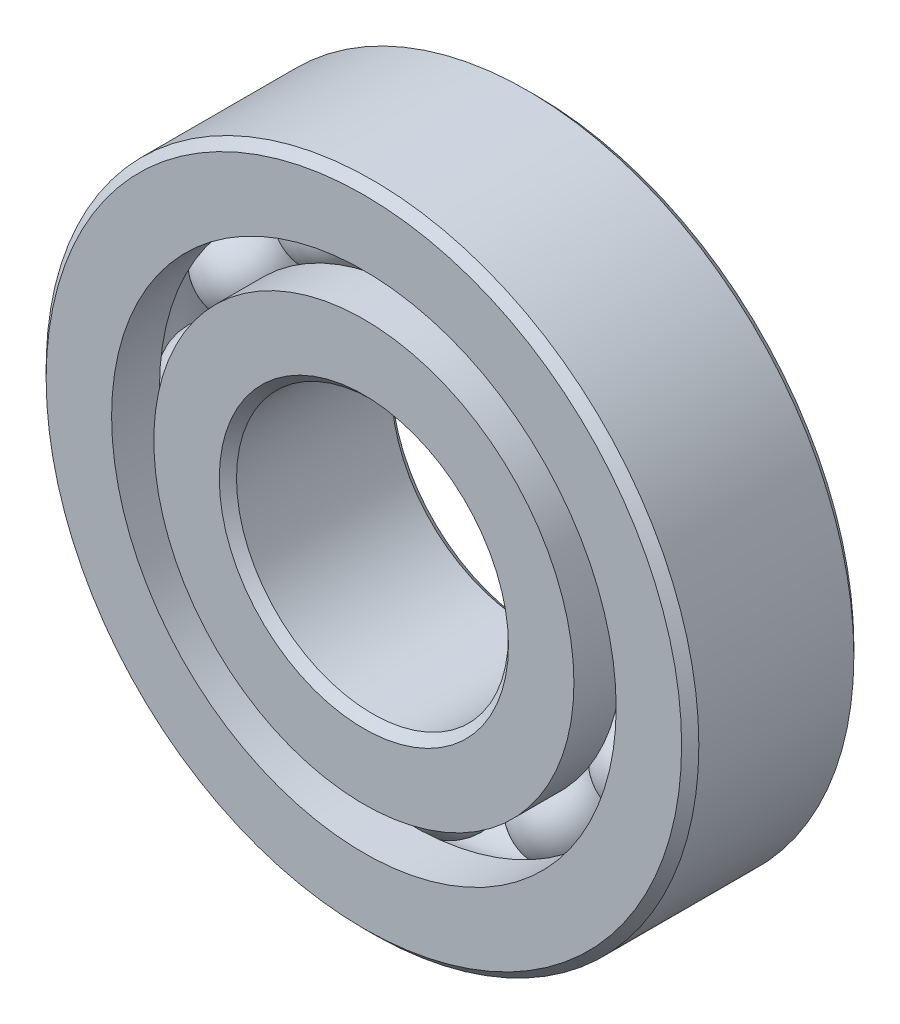
ISO-10303-21;
HEADER;
FILE_DESCRIPTION(('STEP AP214'),'2;1');
FILE_NAME('part.step','',(''),(''),'','','');
FILE_SCHEMA(('AUTOMOTIVE_DESIGN { 1 0 10303 214 1 1 1 1 }'));
ENDSEC;
DATA;
#1=APPLICATION_CONTEXT('core data for automotive mechanical design processes');
#2=APPLICATION_PROTOCOL_DEFINITION('international standard','automotive_design',2000,#1);
#3=PRODUCT_CONTEXT('',#1,'mechanical');
#4=PRODUCT('Part','Part','',(#3));
#5=PRODUCT_RELATED_PRODUCT_CATEGORY('part','',(#4));
#6=PRODUCT_DEFINITION_FORMATION('','',#4);
#7=PRODUCT_DEFINITION_CONTEXT('part definition',#1,'design');
#8=PRODUCT_DEFINITION('design','',#6,#7);
#9=PRODUCT_DEFINITION_SHAPE('','',#8);
#10=(LENGTH_UNIT() NAMED_UNIT(*) SI_UNIT(.MILLI.,.METRE.));
#11=(NAMED_UNIT(*) PLANE_ANGLE_UNIT() SI_UNIT($,.RADIAN.));
#12=(NAMED_UNIT(*) SI_UNIT($,.STERADIAN.) SOLID_ANGLE_UNIT());
#13=UNCERTAINTY_MEASURE_WITH_UNIT(LENGTH_MEASURE(1.E-05),#10,'distance_accuracy_value','');
#14=(GEOMETRIC_REPRESENTATION_CONTEXT(3) GLOBAL_UNCERTAINTY_ASSIGNED_CONTEXT((#13)) GLOBAL_UNIT_ASSIGNED_CONTEXT((#10,
#11,#12)) REPRESENTATION_CONTEXT('',''));
#15=CARTESIAN_POINT('',(0.,0.,0.));
#16=DIRECTION('',(0.,0.,1.));
#17=DIRECTION('',(1.,0.,0.));
#18=AXIS2_PLACEMENT_3D('',#15,#16,#17);
#19=CARTESIAN_POINT('',(-12.7499999999997,22.0836477965033,0.));
#20=DIRECTION('',(0.,0.,1.));
#21=DIRECTION('',(-0.499999999999989,0.866025403784445,0.));
#22=AXIS2_PLACEMENT_3D('',#19,#20,#21);
#23=SPHERICAL_SURFACE('',#22,4.82229450975087);
#24=CARTESIAN_POINT('',(-12.7499999999997,22.0836477965033,4.82229450975087));
#25=VERTEX_POINT('',#24);
#26=VERTEX_LOOP('',#25);
#27=FACE_BOUND('',#26,.T.);
#28=ADVANCED_FACE('F49',(#27),#23,.T.);
#29=CLOSED_SHELL('',(#28));
#30=MANIFOLD_SOLID_BREP('B2',#29);
#31=CARTESIAN_POINT('',(-22.083647796503,12.7500000000003,0.));
#32=DIRECTION('',(0.,0.,1.));
#33=DIRECTION('',(-0.866025403784433,0.50000000000001,0.));
#34=AXIS2_PLACEMENT_3D('',#31,#32,#33);
#35=SPHERICAL_SURFACE('',#34,4.82229450975087);
#36=CARTESIAN_POINT('',(-22.083647796503,12.7500000000003,4.82229450975087));
#37=VERTEX_POINT('',#36);
#38=VERTEX_LOOP('',#37);
#39=FACE_BOUND('',#38,.T.);
#40=ADVANCED_FACE('F74',(#39),#35,.T.);
#41=CLOSED_SHELL('',(#40));
#42=MANIFOLD_SOLID_BREP('B7',#41);
#43=CARTESIAN_POINT('',(-25.5,2.670983224215E-13,0.));
#44=DIRECTION('',(0.,0.,1.));
#45=DIRECTION('',(-1.,0.,0.));
#46=AXIS2_PLACEMENT_3D('',#43,#44,#45);
#47=SPHERICAL_SURFACE('',#46,4.82229450975087);
#48=CARTESIAN_POINT('',(-25.5,2.670983224215E-13,4.82229450975087));
#49=VERTEX_POINT('',#48);
#50=VERTEX_LOOP('',#49);
#51=FACE_BOUND('',#50,.T.);
#52=ADVANCED_FACE('F99',(#51),#47,.T.);
#53=CLOSED_SHELL('',(#52));
#54=MANIFOLD_SOLID_BREP('B45',#53);
#55=CARTESIAN_POINT('',(-22.0836477965033,-12.7499999999998,0.));
#56=DIRECTION('',(0.,0.,1.));
#57=DIRECTION('',(-0.866025403784443,-0.499999999999992,0.));
#58=AXIS2_PLACEMENT_3D('',#55,#56,#57);
#59=SPHERICAL_SURFACE('',#58,4.82229450975087);
#60=CARTESIAN_POINT('',(-22.0836477965033,-12.7499999999998,4.82229450975087));
#61=VERTEX_POINT('',#60);
#62=VERTEX_LOOP('',#61);
#63=FACE_BOUND('',#62,.T.);
#64=ADVANCED_FACE('F125',(#63),#59,.T.);
#65=CLOSED_SHELL('',(#64));
#66=MANIFOLD_SOLID_BREP('B70',#65);
#67=CARTESIAN_POINT('',(-12.7500000000002,-22.0836477965031,0.));
#68=DIRECTION('',(0.,0.,1.));
#69=DIRECTION('',(-0.500000000000007,-0.866025403784435,0.));
#70=AXIS2_PLACEMENT_3D('',#67,#68,#69);
#71=SPHERICAL_SURFACE('',#70,4.82229450975087);
#72=CARTESIAN_POINT('',(-12.7500000000002,-22.0836477965031,4.82229450975087));
#73=VERTEX_POINT('',#72);
#74=VERTEX_LOOP('',#73);
#75=FACE_BOUND('',#74,.T.);
#76=ADVANCED_FACE('F150',(#75),#71,.T.);
#77=CLOSED_SHELL('',(#76));
#78=MANIFOLD_SOLID_BREP('B95',#77);
#79=CARTESIAN_POINT('',(-1.78065548281E-13,-25.5,0.));
#80=DIRECTION('',(0.,0.,1.));
#81=DIRECTION('',(0.,-1.,0.));
#82=AXIS2_PLACEMENT_3D('',#79,#80,#81);
#83=SPHERICAL_SURFACE('',#82,4.82229450975087);
#84=CARTESIAN_POINT('',(-1.78065548281E-13,-25.5,4.82229450975087));
#85=VERTEX_POINT('',#84);
#86=VERTEX_LOOP('',#85);
#87=FACE_BOUND('',#86,.T.);
#88=ADVANCED_FACE('F176',(#87),#83,.T.);
#89=CLOSED_SHELL('',(#88));
#90=MANIFOLD_SOLID_BREP('B121',#89);
#91=CARTESIAN_POINT('',(12.7499999999999,-22.0836477965033,0.));
#92=DIRECTION('',(0.,0.,1.));
#93=DIRECTION('',(0.499999999999995,-0.866025403784442,0.));
#94=AXIS2_PLACEMENT_3D('',#91,#92,#93);
#95=SPHERICAL_SURFACE('',#94,4.82229450975087);
#96=CARTESIAN_POINT('',(12.7499999999999,-22.0836477965033,4.82229450975087));
#97=VERTEX_POINT('',#96);
#98=VERTEX_LOOP('',#97);
#99=FACE_BOUND('',#98,.T.);
#100=ADVANCED_FACE('F200',(#99),#95,.T.);
#101=CLOSED_SHELL('',(#100));
#102=MANIFOLD_SOLID_BREP('B146',#101);
#103=CARTESIAN_POINT('',(22.0836477965031,-12.7500000000001,0.));
#104=DIRECTION('',(0.,0.,1.));
#105=DIRECTION('',(0.866025403784436,-0.500000000000004,0.));
#106=AXIS2_PLACEMENT_3D('',#103,#104,#105);
#107=SPHERICAL_SURFACE('',#106,4.82229450975087);
#108=CARTESIAN_POINT('',(22.0836477965031,-12.7500000000001,4.82229450975087));
#109=VERTEX_POINT('',#108);
#110=VERTEX_LOOP('',#109);
#111=FACE_BOUND('',#110,.T.);
#112=ADVANCED_FACE('F222',(#111),#107,.T.);
#113=CLOSED_SHELL('',(#112));
#114=MANIFOLD_SOLID_BREP('B172',#113);
#115=CARTESIAN_POINT('',(25.5,0.,0.));
#116=DIRECTION('',(0.,0.,1.));
#117=DIRECTION('',(1.,0.,0.));
#118=AXIS2_PLACEMENT_3D('',#115,#116,#117);
#119=SPHERICAL_SURFACE('',#118,4.82229450975087);
#120=CARTESIAN_POINT('',(25.5,0.,4.82229450975087));
#121=VERTEX_POINT('',#120);
#122=VERTEX_LOOP('',#121);
#123=FACE_BOUND('',#122,.T.);
#124=ADVANCED_FACE('F247',(#123),#119,.T.);
#125=CLOSED_SHELL('',(#124));
#126=MANIFOLD_SOLID_BREP('B196',#125);
#127=CARTESIAN_POINT('',(22.0836477965032,12.7499999999999,0.));
#128=DIRECTION('',(0.,0.,1.));
#129=DIRECTION('',(0.86602540378444,0.499999999999998,0.));
#130=AXIS2_PLACEMENT_3D('',#127,#128,#129);
#131=SPHERICAL_SURFACE('',#130,4.82229450975087);
#132=CARTESIAN_POINT('',(22.0836477965032,12.7499999999999,4.82229450975087));
#133=VERTEX_POINT('',#132);
#134=VERTEX_LOOP('',#133);
#135=FACE_BOUND('',#134,.T.);
#136=ADVANCED_FACE('F272',(#135),#131,.T.);
#137=CLOSED_SHELL('',(#136));
#138=MANIFOLD_SOLID_BREP('B218',#137);
#139=CARTESIAN_POINT('',(12.75,22.0836477965032,0.));
#140=DIRECTION('',(0.,0.,1.));
#141=DIRECTION('',(0.500000000000001,0.866025403784438,0.));
#142=AXIS2_PLACEMENT_3D('',#139,#140,#141);
#143=SPHERICAL_SURFACE('',#142,4.82229450975087);
#144=CARTESIAN_POINT('',(12.75,22.0836477965032,4.82229450975087));
#145=VERTEX_POINT('',#144);
#146=VERTEX_LOOP('',#145);
#147=FACE_BOUND('',#146,.T.);
#148=ADVANCED_FACE('F297',(#147),#143,.T.);
#149=CLOSED_SHELL('',(#148));
#150=MANIFOLD_SOLID_BREP('B243',#149);
#151=CARTESIAN_POINT('',(0.,25.5,0.));
#152=DIRECTION('',(0.,0.,1.));
#153=DIRECTION('',(0.,1.,0.));
#154=AXIS2_PLACEMENT_3D('',#151,#152,#153);
#155=SPHERICAL_SURFACE('',#154,4.82229450975087);
#156=CARTESIAN_POINT('',(0.,25.5,4.82229450975087));
#157=VERTEX_POINT('',#156);
#158=VERTEX_LOOP('',#157);
#159=FACE_BOUND('',#158,.T.);
#160=ADVANCED_FACE('F325',(#159),#155,.T.);
#161=CLOSED_SHELL('',(#160));
#162=MANIFOLD_SOLID_BREP('B268',#161);
#163=CARTESIAN_POINT('',(0.,23.1703296703297,9.50000000000001));
#164=DIRECTION('',(0.,0.,-1.));
#165=DIRECTION('',(-1.,0.,0.));
#166=AXIS2_PLACEMENT_3D('',#163,#164,#165);
#167=PLANE('',#166);
#168=CARTESIAN_POINT('',(0.,0.,9.50000000000001));
#169=DIRECTION('',(0.,0.,1.));
#170=DIRECTION('',(1.,0.,0.));
#171=AXIS2_PLACEMENT_3D('',#168,#169,#170);
#172=CIRCLE('',#171,15.95);
#173=CARTESIAN_POINT('',(15.95,0.,9.50000000000001));
#174=VERTEX_POINT('',#173);
#175=EDGE_CURVE('E381',#174,#174,#172,.T.);
#176=ORIENTED_EDGE('',*,*,#175,.F.);
#177=EDGE_LOOP('',(#176));
#178=FACE_BOUND('',#177,.T.);
#179=CARTESIAN_POINT('',(0.,0.,9.50000000000001));
#180=DIRECTION('',(0.,0.,1.));
#181=DIRECTION('',(1.,0.,0.));
#182=AXIS2_PLACEMENT_3D('',#179,#180,#181);
#183=CIRCLE('',#182,23.1703296703297);
#184=CARTESIAN_POINT('',(23.1703296703297,0.,9.50000000000001));
#185=VERTEX_POINT('',#184);
#186=EDGE_CURVE('E324',#185,#185,#183,.T.);
#187=ORIENTED_EDGE('',*,*,#186,.T.);
#188=EDGE_LOOP('',(#187));
#189=FACE_BOUND('',#188,.T.);
#190=ADVANCED_FACE('F353',(#178,#189),#167,.F.);
#191=CARTESIAN_POINT('',(0.,0.,9.5));
#192=DIRECTION('',(0.,0.,1.));
#193=DIRECTION('',(1.,0.,0.));
#194=AXIS2_PLACEMENT_3D('',#191,#192,#193);
#195=CYLINDRICAL_SURFACE('',#194,23.1703296703297);
#196=ORIENTED_EDGE('',*,*,#186,.F.);
#197=EDGE_LOOP('',(#196));
#198=FACE_BOUND('',#197,.T.);
#199=CARTESIAN_POINT('',(0.,0.,4.22222222222222));
#200=DIRECTION('',(0.,0.,1.));
#201=DIRECTION('',(1.,0.,0.));
#202=AXIS2_PLACEMENT_3D('',#199,#200,#201);
#203=CIRCLE('',#202,23.1703296703297);
#204=CARTESIAN_POINT('',(23.1703296703297,0.,4.22222222222222));
#205=VERTEX_POINT('',#204);
#206=EDGE_CURVE('E359',#205,#205,#203,.T.);
#207=ORIENTED_EDGE('',*,*,#206,.T.);
#208=EDGE_LOOP('',(#207));
#209=FACE_BOUND('',#208,.T.);
#210=ADVANCED_FACE('F388',(#198,#209),#195,.T.);
#211=CARTESIAN_POINT('',(0.,0.,0.));
#212=DIRECTION('',(0.,0.,1.));
#213=DIRECTION('',(1.,0.,0.));
#214=AXIS2_PLACEMENT_3D('',#211,#212,#213);
#215=TOROIDAL_SURFACE('',#214,25.5,4.82229450975087);
#216=ORIENTED_EDGE('',*,*,#206,.F.);
#217=EDGE_LOOP('',(#216));
#218=FACE_BOUND('',#217,.T.);
#219=CARTESIAN_POINT('',(0.,0.,-4.22222222222223));
#220=DIRECTION('',(0.,0.,1.));
#221=DIRECTION('',(1.,0.,0.));
#222=AXIS2_PLACEMENT_3D('',#219,#220,#221);
#223=CIRCLE('',#222,23.1703296703297);
#224=CARTESIAN_POINT('',(23.1703296703297,0.,-4.22222222222223));
#225=VERTEX_POINT('',#224);
#226=EDGE_CURVE('E363',#225,#225,#223,.T.);
#227=ORIENTED_EDGE('',*,*,#226,.T.);
#228=EDGE_LOOP('',(#227));
#229=FACE_BOUND('',#228,.T.);
#230=ADVANCED_FACE('F392',(#218,#229),#215,.F.);
#231=CARTESIAN_POINT('',(0.,0.,9.5));
#232=DIRECTION('',(0.,0.,1.));
#233=DIRECTION('',(1.,0.,0.));
#234=AXIS2_PLACEMENT_3D('',#231,#232,#233);
#235=CYLINDRICAL_SURFACE('',#234,23.1703296703297);
#236=ORIENTED_EDGE('',*,*,#226,.F.);
#237=EDGE_LOOP('',(#236));
#238=FACE_BOUND('',#237,.T.);
#239=CARTESIAN_POINT('',(0.,0.,-9.50000000000001));
#240=DIRECTION('',(0.,0.,1.));
#241=DIRECTION('',(1.,0.,0.));
#242=AXIS2_PLACEMENT_3D('',#239,#240,#241);
#243=CIRCLE('',#242,23.1703296703297);
#244=CARTESIAN_POINT('',(23.1703296703297,0.,-9.50000000000001));
#245=VERTEX_POINT('',#244);
#246=EDGE_CURVE('E367',#245,#245,#243,.T.);
#247=ORIENTED_EDGE('',*,*,#246,.T.);
#248=EDGE_LOOP('',(#247));
#249=FACE_BOUND('',#248,.T.);
#250=ADVANCED_FACE('F397',(#238,#249),#235,.T.);
#251=CARTESIAN_POINT('',(0.,15.95,-9.5));
#252=DIRECTION('',(0.,0.,1.));
#253=DIRECTION('',(1.,0.,0.));
#254=AXIS2_PLACEMENT_3D('',#251,#252,#253);
#255=PLANE('',#254);
#256=ORIENTED_EDGE('',*,*,#246,.F.);
#257=EDGE_LOOP('',(#256));
#258=FACE_BOUND('',#257,.T.);
#259=CARTESIAN_POINT('',(0.,0.,-9.5));
#260=DIRECTION('',(0.,0.,1.));
#261=DIRECTION('',(1.,0.,0.));
#262=AXIS2_PLACEMENT_3D('',#259,#260,#261);
#263=CIRCLE('',#262,15.95);
#264=CARTESIAN_POINT('',(15.95,0.,-9.5));
#265=VERTEX_POINT('',#264);
#266=EDGE_CURVE('E372',#265,#265,#263,.T.);
#267=ORIENTED_EDGE('',*,*,#266,.T.);
#268=EDGE_LOOP('',(#267));
#269=FACE_BOUND('',#268,.T.);
#270=ADVANCED_FACE('F403',(#258,#269),#255,.F.);
#271=CARTESIAN_POINT('',(0.,0.,-8.55));
#272=DIRECTION('',(0.,0.,-1.));
#273=DIRECTION('',(-1.,0.,0.));
#274=AXIS2_PLACEMENT_3D('',#271,#272,#273);
#275=CONICAL_SURFACE('',#274,15.,0.785398163397447);
#276=ORIENTED_EDGE('',*,*,#266,.F.);
#277=EDGE_LOOP('',(#276));
#278=FACE_BOUND('',#277,.T.);
#279=CARTESIAN_POINT('',(0.,0.,-8.55));
#280=DIRECTION('',(0.,0.,1.));
#281=DIRECTION('',(1.,0.,0.));
#282=AXIS2_PLACEMENT_3D('',#279,#280,#281);
#283=CIRCLE('',#282,15.);
#284=CARTESIAN_POINT('',(15.,0.,-8.55));
#285=VERTEX_POINT('',#284);
#286=EDGE_CURVE('E375',#285,#285,#283,.T.);
#287=ORIENTED_EDGE('',*,*,#286,.T.);
#288=EDGE_LOOP('',(#287));
#289=FACE_BOUND('',#288,.T.);
#290=ADVANCED_FACE('F407',(#278,#289),#275,.F.);
#291=CARTESIAN_POINT('',(0.,0.,9.5));
#292=DIRECTION('',(0.,0.,1.));
#293=DIRECTION('',(1.,0.,0.));
#294=AXIS2_PLACEMENT_3D('',#291,#292,#293);
#295=CYLINDRICAL_SURFACE('',#294,15.);
#296=ORIENTED_EDGE('',*,*,#286,.F.);
#297=EDGE_LOOP('',(#296));
#298=FACE_BOUND('',#297,.T.);
#299=CARTESIAN_POINT('',(0.,0.,8.55000000000002));
#300=DIRECTION('',(0.,0.,1.));
#301=DIRECTION('',(1.,0.,0.));
#302=AXIS2_PLACEMENT_3D('',#299,#300,#301);
#303=CIRCLE('',#302,15.);
#304=CARTESIAN_POINT('',(15.,0.,8.55000000000002));
#305=VERTEX_POINT('',#304);
#306=EDGE_CURVE('E378',#305,#305,#303,.T.);
#307=ORIENTED_EDGE('',*,*,#306,.T.);
#308=EDGE_LOOP('',(#307));
#309=FACE_BOUND('',#308,.T.);
#310=ADVANCED_FACE('F411',(#298,#309),#295,.F.);
#311=CARTESIAN_POINT('',(0.,0.,9.50000000000001));
#312=DIRECTION('',(0.,0.,1.));
#313=DIRECTION('',(1.,0.,0.));
#314=AXIS2_PLACEMENT_3D('',#311,#312,#313);
#315=CONICAL_SURFACE('',#314,15.95,0.785398163397453);
#316=ORIENTED_EDGE('',*,*,#306,.F.);
#317=EDGE_LOOP('',(#316));
#318=FACE_BOUND('',#317,.T.);
#319=ORIENTED_EDGE('',*,*,#175,.T.);
#320=EDGE_LOOP('',(#319));
#321=FACE_BOUND('',#320,.T.);
#322=ADVANCED_FACE('F385',(#318,#321),#315,.F.);
#323=CLOSED_SHELL('',(#190,#210,#230,#250,#270,#290,#310,#322));
#324=MANIFOLD_SOLID_BREP('B293',#323);
#325=CARTESIAN_POINT('',(0.,0.,8.55000000000001));
#326=DIRECTION('',(0.,0.,-1.));
#327=DIRECTION('',(-1.,0.,0.));
#328=AXIS2_PLACEMENT_3D('',#325,#326,#327);
#329=CONICAL_SURFACE('',#328,36.,0.785398163397445);
#330=CARTESIAN_POINT('',(0.,0.,9.50000000000001));
#331=DIRECTION('',(0.,0.,1.));
#332=DIRECTION('',(1.,0.,0.));
#333=AXIS2_PLACEMENT_3D('',#330,#331,#332);
#334=CIRCLE('',#333,35.05);
#335=CARTESIAN_POINT('',(35.05,0.,9.50000000000001));
#336=VERTEX_POINT('',#335);
#337=EDGE_CURVE('E509',#336,#336,#334,.T.);
#338=ORIENTED_EDGE('',*,*,#337,.F.);
#339=EDGE_LOOP('',(#338));
#340=FACE_BOUND('',#339,.T.);
#341=CARTESIAN_POINT('',(0.,0.,8.55000000000001));
#342=DIRECTION('',(0.,0.,1.));
#343=DIRECTION('',(1.,0.,0.));
#344=AXIS2_PLACEMENT_3D('',#341,#342,#343);
#345=CIRCLE('',#344,36.);
#346=CARTESIAN_POINT('',(36.,0.,8.55000000000001));
#347=VERTEX_POINT('',#346);
#348=EDGE_CURVE('E352',#347,#347,#345,.T.);
#349=ORIENTED_EDGE('',*,*,#348,.T.);
#350=EDGE_LOOP('',(#349));
#351=FACE_BOUND('',#350,.T.);
#352=ADVANCED_FACE('F481',(#340,#351),#329,.T.);
#353=CARTESIAN_POINT('',(0.,0.,9.5));
#354=DIRECTION('',(0.,0.,1.));
#355=DIRECTION('',(1.,0.,0.));
#356=AXIS2_PLACEMENT_3D('',#353,#354,#355);
#357=CYLINDRICAL_SURFACE('',#356,36.);
#358=ORIENTED_EDGE('',*,*,#348,.F.);
#359=EDGE_LOOP('',(#358));
#360=FACE_BOUND('',#359,.T.);
#361=CARTESIAN_POINT('',(0.,0.,-8.55));
#362=DIRECTION('',(0.,0.,1.));
#363=DIRECTION('',(1.,0.,0.));
#364=AXIS2_PLACEMENT_3D('',#361,#362,#363);
#365=CIRCLE('',#364,36.);
#366=CARTESIAN_POINT('',(36.,0.,-8.55));
#367=VERTEX_POINT('',#366);
#368=EDGE_CURVE('E487',#367,#367,#365,.T.);
#369=ORIENTED_EDGE('',*,*,#368,.T.);
#370=EDGE_LOOP('',(#369));
#371=FACE_BOUND('',#370,.T.);
#372=ADVANCED_FACE('F516',(#360,#371),#357,.T.);
#373=CARTESIAN_POINT('',(0.,0.,-9.5));
#374=DIRECTION('',(0.,0.,1.));
#375=DIRECTION('',(1.,0.,0.));
#376=AXIS2_PLACEMENT_3D('',#373,#374,#375);
#377=CONICAL_SURFACE('',#376,35.05,0.785398163397445);
#378=ORIENTED_EDGE('',*,*,#368,.F.);
#379=EDGE_LOOP('',(#378));
#380=FACE_BOUND('',#379,.T.);
#381=CARTESIAN_POINT('',(0.,0.,-9.5));
#382=DIRECTION('',(0.,0.,1.));
#383=DIRECTION('',(1.,0.,0.));
#384=AXIS2_PLACEMENT_3D('',#381,#382,#383);
#385=CIRCLE('',#384,35.05);
#386=CARTESIAN_POINT('',(35.05,0.,-9.5));
#387=VERTEX_POINT('',#386);
#388=EDGE_CURVE('E491',#387,#387,#385,.T.);
#389=ORIENTED_EDGE('',*,*,#388,.T.);
#390=EDGE_LOOP('',(#389));
#391=FACE_BOUND('',#390,.T.);
#392=ADVANCED_FACE('F520',(#380,#391),#377,.T.);
#393=CARTESIAN_POINT('',(0.,35.05,-9.5));
#394=DIRECTION('',(0.,0.,1.));
#395=DIRECTION('',(1.,0.,0.));
#396=AXIS2_PLACEMENT_3D('',#393,#394,#395);
#397=PLANE('',#396);
#398=ORIENTED_EDGE('',*,*,#388,.F.);
#399=EDGE_LOOP('',(#398));
#400=FACE_BOUND('',#399,.T.);
#401=CARTESIAN_POINT('',(0.,0.,-9.5));
#402=DIRECTION('',(0.,0.,1.));
#403=DIRECTION('',(1.,0.,0.));
#404=AXIS2_PLACEMENT_3D('',#401,#402,#403);
#405=CIRCLE('',#404,27.8296703296703);
#406=CARTESIAN_POINT('',(27.8296703296703,0.,-9.5));
#407=VERTEX_POINT('',#406);
#408=EDGE_CURVE('E495',#407,#407,#405,.T.);
#409=ORIENTED_EDGE('',*,*,#408,.T.);
#410=EDGE_LOOP('',(#409));
#411=FACE_BOUND('',#410,.T.);
#412=ADVANCED_FACE('F525',(#400,#411),#397,.F.);
#413=CARTESIAN_POINT('',(0.,0.,9.5));
#414=DIRECTION('',(0.,0.,1.));
#415=DIRECTION('',(1.,0.,0.));
#416=AXIS2_PLACEMENT_3D('',#413,#414,#415);
#417=CYLINDRICAL_SURFACE('',#416,27.8296703296703);
#418=ORIENTED_EDGE('',*,*,#408,.F.);
#419=EDGE_LOOP('',(#418));
#420=FACE_BOUND('',#419,.T.);
#421=CARTESIAN_POINT('',(0.,0.,-4.22222222222222));
#422=DIRECTION('',(0.,0.,1.));
#423=DIRECTION('',(1.,0.,0.));
#424=AXIS2_PLACEMENT_3D('',#421,#422,#423);
#425=CIRCLE('',#424,27.8296703296703);
#426=CARTESIAN_POINT('',(27.8296703296703,0.,-4.22222222222222));
#427=VERTEX_POINT('',#426);
#428=EDGE_CURVE('E500',#427,#427,#425,.T.);
#429=ORIENTED_EDGE('',*,*,#428,.T.);
#430=EDGE_LOOP('',(#429));
#431=FACE_BOUND('',#430,.T.);
#432=ADVANCED_FACE('F531',(#420,#431),#417,.F.);
#433=CARTESIAN_POINT('',(0.,0.,0.));
#434=DIRECTION('',(0.,0.,1.));
#435=DIRECTION('',(1.,0.,0.));
#436=AXIS2_PLACEMENT_3D('',#433,#434,#435);
#437=TOROIDAL_SURFACE('',#436,25.5,4.82229450975087);
#438=ORIENTED_EDGE('',*,*,#428,.F.);
#439=EDGE_LOOP('',(#438));
#440=FACE_BOUND('',#439,.T.);
#441=CARTESIAN_POINT('',(0.,0.,4.22222222222222));
#442=DIRECTION('',(0.,0.,1.));
#443=DIRECTION('',(1.,0.,0.));
#444=AXIS2_PLACEMENT_3D('',#441,#442,#443);
#445=CIRCLE('',#444,27.8296703296703);
#446=CARTESIAN_POINT('',(27.8296703296703,0.,4.22222222222222));
#447=VERTEX_POINT('',#446);
#448=EDGE_CURVE('E503',#447,#447,#445,.T.);
#449=ORIENTED_EDGE('',*,*,#448,.T.);
#450=EDGE_LOOP('',(#449));
#451=FACE_BOUND('',#450,.T.);
#452=ADVANCED_FACE('F535',(#440,#451),#437,.F.);
#453=CARTESIAN_POINT('',(0.,0.,9.5));
#454=DIRECTION('',(0.,0.,1.));
#455=DIRECTION('',(1.,0.,0.));
#456=AXIS2_PLACEMENT_3D('',#453,#454,#455);
#457=CYLINDRICAL_SURFACE('',#456,27.8296703296703);
#458=ORIENTED_EDGE('',*,*,#448,.F.);
#459=EDGE_LOOP('',(#458));
#460=FACE_BOUND('',#459,.T.);
#461=CARTESIAN_POINT('',(0.,0.,9.50000000000001));
#462=DIRECTION('',(0.,0.,1.));
#463=DIRECTION('',(1.,0.,0.));
#464=AXIS2_PLACEMENT_3D('',#461,#462,#463);
#465=CIRCLE('',#464,27.8296703296703);
#466=CARTESIAN_POINT('',(27.8296703296703,0.,9.50000000000001));
#467=VERTEX_POINT('',#466);
#468=EDGE_CURVE('E506',#467,#467,#465,.T.);
#469=ORIENTED_EDGE('',*,*,#468,.T.);
#470=EDGE_LOOP('',(#469));
#471=FACE_BOUND('',#470,.T.);
#472=ADVANCED_FACE('F539',(#460,#471),#457,.F.);
#473=CARTESIAN_POINT('',(0.,35.05,9.50000000000001));
#474=DIRECTION('',(0.,0.,-1.));
#475=DIRECTION('',(-1.,0.,0.));
#476=AXIS2_PLACEMENT_3D('',#473,#474,#475);
#477=PLANE('',#476);
#478=ORIENTED_EDGE('',*,*,#468,.F.);
#479=EDGE_LOOP('',(#478));
#480=FACE_BOUND('',#479,.T.);
#481=ORIENTED_EDGE('',*,*,#337,.T.);
#482=EDGE_LOOP('',(#481));
#483=FACE_BOUND('',#482,.T.);
#484=ADVANCED_FACE('F513',(#480,#483),#477,.F.);
#485=CLOSED_SHELL('',(#352,#372,#392,#412,#432,#452,#472,#484));
#486=MANIFOLD_SOLID_BREP('B319',#485);
#487=ADVANCED_BREP_SHAPE_REPRESENTATION('',(#18,#30,#42,#54,#66,#78,#90,#102,#114,#126,#138,
#150,#162,#324,#486),#14);
#488=SHAPE_DEFINITION_REPRESENTATION(#9,#487);
ENDSEC;
END-ISO-10303-21;
